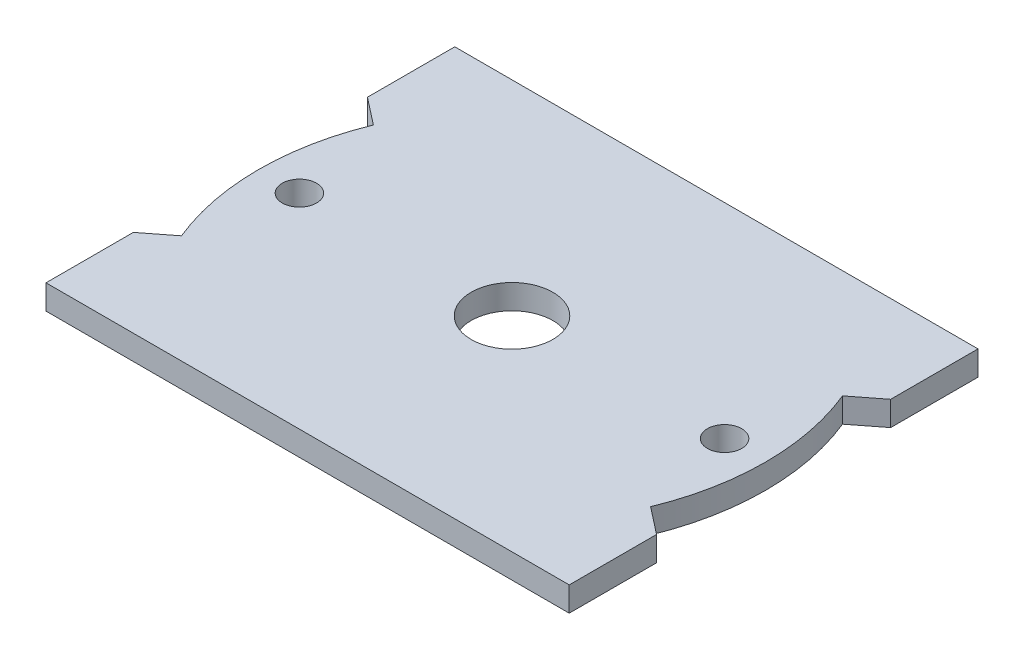
ISO-10303-21;
HEADER;
FILE_DESCRIPTION(('STEP AP214'),'2;1');
FILE_NAME('part.step','',(''),(''),'','','');
FILE_SCHEMA(('AUTOMOTIVE_DESIGN { 1 0 10303 214 1 1 1 1 }'));
ENDSEC;
DATA;
#1=APPLICATION_CONTEXT('core data for automotive mechanical design processes');
#2=APPLICATION_PROTOCOL_DEFINITION('international standard','automotive_design',2000,#1);
#3=PRODUCT_CONTEXT('',#1,'mechanical');
#4=PRODUCT('Part','Part','',(#3));
#5=PRODUCT_RELATED_PRODUCT_CATEGORY('part','',(#4));
#6=PRODUCT_DEFINITION_FORMATION('','',#4);
#7=PRODUCT_DEFINITION_CONTEXT('part definition',#1,'design');
#8=PRODUCT_DEFINITION('design','',#6,#7);
#9=PRODUCT_DEFINITION_SHAPE('','',#8);
#10=(LENGTH_UNIT() NAMED_UNIT(*) SI_UNIT(.MILLI.,.METRE.));
#11=(NAMED_UNIT(*) PLANE_ANGLE_UNIT() SI_UNIT($,.RADIAN.));
#12=(NAMED_UNIT(*) SI_UNIT($,.STERADIAN.) SOLID_ANGLE_UNIT());
#13=UNCERTAINTY_MEASURE_WITH_UNIT(LENGTH_MEASURE(1.E-05),#10,'distance_accuracy_value','');
#14=(GEOMETRIC_REPRESENTATION_CONTEXT(3) GLOBAL_UNCERTAINTY_ASSIGNED_CONTEXT((#13)) GLOBAL_UNIT_ASSIGNED_CONTEXT((#10,
#11,#12)) REPRESENTATION_CONTEXT('',''));
#15=CARTESIAN_POINT('',(0.,0.,0.));
#16=DIRECTION('',(0.,0.,1.));
#17=DIRECTION('',(1.,0.,0.));
#18=AXIS2_PLACEMENT_3D('',#15,#16,#17);
#19=CARTESIAN_POINT('',(26.,3.,0.));
#20=DIRECTION('',(0.,-1.,0.));
#21=DIRECTION('',(0.,0.,-1.));
#22=AXIS2_PLACEMENT_3D('',#19,#20,#21);
#23=CYLINDRICAL_SURFACE('',#22,2.1);
#24=CARTESIAN_POINT('',(26.,3.,0.));
#25=DIRECTION('',(0.,1.,0.));
#26=DIRECTION('',(0.,0.,1.));
#27=AXIS2_PLACEMENT_3D('',#24,#25,#26);
#28=CIRCLE('',#27,2.1);
#29=CARTESIAN_POINT('',(26.,3.,2.09999999999999));
#30=VERTEX_POINT('',#29);
#31=EDGE_CURVE('E200',#30,#30,#28,.F.);
#32=ORIENTED_EDGE('',*,*,#31,.F.);
#33=EDGE_LOOP('',(#32));
#34=FACE_BOUND('',#33,.T.);
#35=CARTESIAN_POINT('',(26.,0.,0.));
#36=DIRECTION('',(0.,1.,0.));
#37=DIRECTION('',(0.,0.,1.));
#38=AXIS2_PLACEMENT_3D('',#35,#36,#37);
#39=CIRCLE('',#38,2.1);
#40=CARTESIAN_POINT('',(26.,0.,2.09999999999999));
#41=VERTEX_POINT('',#40);
#42=EDGE_CURVE('E235',#41,#41,#39,.F.);
#43=ORIENTED_EDGE('',*,*,#42,.T.);
#44=EDGE_LOOP('',(#43));
#45=FACE_BOUND('',#44,.T.);
#46=ADVANCED_FACE('F76',(#34,#45),#23,.F.);
#47=CARTESIAN_POINT('',(-26.,3.,0.));
#48=DIRECTION('',(0.,-1.,0.));
#49=DIRECTION('',(0.,0.,-1.));
#50=AXIS2_PLACEMENT_3D('',#47,#48,#49);
#51=CYLINDRICAL_SURFACE('',#50,2.1);
#52=CARTESIAN_POINT('',(-26.,3.,0.));
#53=DIRECTION('',(0.,1.,0.));
#54=DIRECTION('',(0.,0.,1.));
#55=AXIS2_PLACEMENT_3D('',#52,#53,#54);
#56=CIRCLE('',#55,2.1);
#57=CARTESIAN_POINT('',(-26.,3.,2.10000000000001));
#58=VERTEX_POINT('',#57);
#59=EDGE_CURVE('E194',#58,#58,#56,.T.);
#60=ORIENTED_EDGE('',*,*,#59,.T.);
#61=EDGE_LOOP('',(#60));
#62=FACE_BOUND('',#61,.T.);
#63=CARTESIAN_POINT('',(-26.,0.,0.));
#64=DIRECTION('',(0.,1.,0.));
#65=DIRECTION('',(0.,0.,1.));
#66=AXIS2_PLACEMENT_3D('',#63,#64,#65);
#67=CIRCLE('',#66,2.1);
#68=CARTESIAN_POINT('',(-26.,0.,2.10000000000001));
#69=VERTEX_POINT('',#68);
#70=EDGE_CURVE('E232',#69,#69,#67,.T.);
#71=ORIENTED_EDGE('',*,*,#70,.F.);
#72=EDGE_LOOP('',(#71));
#73=FACE_BOUND('',#72,.T.);
#74=ADVANCED_FACE('F308',(#62,#73),#51,.F.);
#75=CARTESIAN_POINT('',(32.,3.,0.));
#76=DIRECTION('',(-1.,0.,0.));
#77=DIRECTION('',(0.,0.,1.));
#78=AXIS2_PLACEMENT_3D('',#75,#76,#77);
#79=PLANE('',#78);
#80=DIRECTION('',(0.,0.,-1.));
#81=VECTOR('',#80,1.);
#82=CARTESIAN_POINT('',(32.,0.,0.));
#83=LINE('',#82,#81);
#84=CARTESIAN_POINT('',(32.,0.,25.));
#85=VERTEX_POINT('',#84);
#86=CARTESIAN_POINT('',(32.,0.,14.320549046737));
#87=VERTEX_POINT('',#86);
#88=EDGE_CURVE('E205',#85,#87,#83,.T.);
#89=ORIENTED_EDGE('',*,*,#88,.T.);
#90=DIRECTION('',(0.,-1.,0.));
#91=VECTOR('',#90,1.);
#92=CARTESIAN_POINT('',(32.,3.,14.320549046737));
#93=LINE('',#92,#91);
#94=CARTESIAN_POINT('',(32.,3.,14.320549046737));
#95=VERTEX_POINT('',#94);
#96=EDGE_CURVE('E86',#95,#87,#93,.T.);
#97=ORIENTED_EDGE('',*,*,#96,.F.);
#98=DIRECTION('',(0.,0.,-1.));
#99=VECTOR('',#98,1.);
#100=CARTESIAN_POINT('',(32.,3.,0.));
#101=LINE('',#100,#99);
#102=CARTESIAN_POINT('',(32.,3.,25.));
#103=VERTEX_POINT('',#102);
#104=EDGE_CURVE('E338',#103,#95,#101,.T.);
#105=ORIENTED_EDGE('',*,*,#104,.F.);
#106=DIRECTION('',(0.,-1.,0.));
#107=VECTOR('',#106,1.);
#108=CARTESIAN_POINT('',(32.,3.,25.));
#109=LINE('',#108,#107);
#110=EDGE_CURVE('E12',#103,#85,#109,.T.);
#111=ORIENTED_EDGE('',*,*,#110,.T.);
#112=EDGE_LOOP('',(#89,#97,#105,#111));
#113=FACE_BOUND('',#112,.T.);
#114=ADVANCED_FACE('F266',(#113),#79,.F.);
#115=CARTESIAN_POINT('',(5.18105564742899,3.,-6.63175122870911));
#116=DIRECTION('',(0.615644041972315,0.,-0.788024373724563));
#117=DIRECTION('',(-0.788024373724563,0.,-0.615644041972315));
#118=AXIS2_PLACEMENT_3D('',#115,#116,#117);
#119=PLANE('',#118);
#120=DIRECTION('',(0.788024373724563,0.,0.615644041972315));
#121=VECTOR('',#120,1.);
#122=CARTESIAN_POINT('',(5.18105564742899,0.,-6.63175122870911));
#123=LINE('',#122,#121);
#124=CARTESIAN_POINT('',(28.6924140746813,0.,11.7364975425818));
#125=VERTEX_POINT('',#124);
#126=EDGE_CURVE('E208',#125,#87,#123,.T.);
#127=ORIENTED_EDGE('',*,*,#126,.F.);
#128=DIRECTION('',(0.,-1.,0.));
#129=VECTOR('',#128,1.);
#130=CARTESIAN_POINT('',(28.6924140746813,3.,11.7364975425818));
#131=LINE('',#130,#129);
#132=CARTESIAN_POINT('',(28.6924140746813,3.,11.7364975425818));
#133=VERTEX_POINT('',#132);
#134=EDGE_CURVE('E255',#133,#125,#131,.T.);
#135=ORIENTED_EDGE('',*,*,#134,.F.);
#136=DIRECTION('',(0.788024373724563,0.,0.615644041972315));
#137=VECTOR('',#136,1.);
#138=CARTESIAN_POINT('',(5.18105564742899,3.,-6.63175122870911));
#139=LINE('',#138,#137);
#140=EDGE_CURVE('E263',#133,#95,#139,.T.);
#141=ORIENTED_EDGE('',*,*,#140,.T.);
#142=ORIENTED_EDGE('',*,*,#96,.T.);
#143=EDGE_LOOP('',(#127,#135,#141,#142));
#144=FACE_BOUND('',#143,.T.);
#145=ADVANCED_FACE('F261',(#144),#119,.T.);
#146=CARTESIAN_POINT('',(0.,3.,0.));
#147=DIRECTION('',(0.,-1.,0.));
#148=DIRECTION('',(0.,0.,-1.));
#149=AXIS2_PLACEMENT_3D('',#146,#147,#148);
#150=CYLINDRICAL_SURFACE('',#149,31.);
#151=CARTESIAN_POINT('',(0.,0.,0.));
#152=DIRECTION('',(0.,1.,0.));
#153=DIRECTION('',(0.,0.,1.));
#154=AXIS2_PLACEMENT_3D('',#151,#152,#153);
#155=CIRCLE('',#154,31.);
#156=CARTESIAN_POINT('',(28.6924140746813,0.,-11.7364975425818));
#157=VERTEX_POINT('',#156);
#158=EDGE_CURVE('E211',#125,#157,#155,.T.);
#159=ORIENTED_EDGE('',*,*,#158,.T.);
#160=DIRECTION('',(0.,-1.,0.));
#161=VECTOR('',#160,1.);
#162=CARTESIAN_POINT('',(28.6924140746813,3.,-11.7364975425818));
#163=LINE('',#162,#161);
#164=CARTESIAN_POINT('',(28.6924140746813,3.,-11.7364975425818));
#165=VERTEX_POINT('',#164);
#166=EDGE_CURVE('E252',#165,#157,#163,.T.);
#167=ORIENTED_EDGE('',*,*,#166,.F.);
#168=CARTESIAN_POINT('',(0.,3.,0.));
#169=DIRECTION('',(0.,1.,0.));
#170=DIRECTION('',(0.,0.,1.));
#171=AXIS2_PLACEMENT_3D('',#168,#169,#170);
#172=CIRCLE('',#171,31.);
#173=EDGE_CURVE('E284',#133,#165,#172,.T.);
#174=ORIENTED_EDGE('',*,*,#173,.F.);
#175=ORIENTED_EDGE('',*,*,#134,.T.);
#176=EDGE_LOOP('',(#159,#167,#174,#175));
#177=FACE_BOUND('',#176,.T.);
#178=ADVANCED_FACE('F275',(#177),#150,.T.);
#179=CARTESIAN_POINT('',(5.18105564742899,3.,6.6317512287091));
#180=DIRECTION('',(-0.615644041972315,0.,-0.788024373724563));
#181=DIRECTION('',(-0.788024373724563,0.,0.615644041972316));
#182=AXIS2_PLACEMENT_3D('',#179,#180,#181);
#183=PLANE('',#182);
#184=DIRECTION('',(0.788024373724563,0.,-0.615644041972316));
#185=VECTOR('',#184,1.);
#186=CARTESIAN_POINT('',(5.18105564742899,0.,6.6317512287091));
#187=LINE('',#186,#185);
#188=CARTESIAN_POINT('',(32.,0.,-14.320549046737));
#189=VERTEX_POINT('',#188);
#190=EDGE_CURVE('E213',#157,#189,#187,.T.);
#191=ORIENTED_EDGE('',*,*,#190,.T.);
#192=DIRECTION('',(0.,-1.,0.));
#193=VECTOR('',#192,1.);
#194=CARTESIAN_POINT('',(32.,3.,-14.320549046737));
#195=LINE('',#194,#193);
#196=CARTESIAN_POINT('',(32.,3.,-14.320549046737));
#197=VERTEX_POINT('',#196);
#198=EDGE_CURVE('E249',#197,#189,#195,.T.);
#199=ORIENTED_EDGE('',*,*,#198,.F.);
#200=DIRECTION('',(0.788024373724563,0.,-0.615644041972316));
#201=VECTOR('',#200,1.);
#202=CARTESIAN_POINT('',(5.18105564742899,3.,6.6317512287091));
#203=LINE('',#202,#201);
#204=EDGE_CURVE('E281',#165,#197,#203,.T.);
#205=ORIENTED_EDGE('',*,*,#204,.F.);
#206=ORIENTED_EDGE('',*,*,#166,.T.);
#207=EDGE_LOOP('',(#191,#199,#205,#206));
#208=FACE_BOUND('',#207,.T.);
#209=ADVANCED_FACE('F279',(#208),#183,.F.);
#210=CARTESIAN_POINT('',(32.,3.,0.));
#211=DIRECTION('',(-1.,0.,0.));
#212=DIRECTION('',(0.,0.,1.));
#213=AXIS2_PLACEMENT_3D('',#210,#211,#212);
#214=PLANE('',#213);
#215=DIRECTION('',(0.,0.,-1.));
#216=VECTOR('',#215,1.);
#217=CARTESIAN_POINT('',(32.,0.,0.));
#218=LINE('',#217,#216);
#219=CARTESIAN_POINT('',(32.,0.,-25.));
#220=VERTEX_POINT('',#219);
#221=EDGE_CURVE('E215',#189,#220,#218,.T.);
#222=ORIENTED_EDGE('',*,*,#221,.T.);
#223=DIRECTION('',(0.,-1.,0.));
#224=VECTOR('',#223,1.);
#225=CARTESIAN_POINT('',(32.,3.,-25.));
#226=LINE('',#225,#224);
#227=CARTESIAN_POINT('',(32.,3.,-25.));
#228=VERTEX_POINT('',#227);
#229=EDGE_CURVE('E246',#228,#220,#226,.T.);
#230=ORIENTED_EDGE('',*,*,#229,.F.);
#231=DIRECTION('',(0.,0.,-1.));
#232=VECTOR('',#231,1.);
#233=CARTESIAN_POINT('',(32.,3.,0.));
#234=LINE('',#233,#232);
#235=EDGE_CURVE('E283',#197,#228,#234,.T.);
#236=ORIENTED_EDGE('',*,*,#235,.F.);
#237=ORIENTED_EDGE('',*,*,#198,.T.);
#238=EDGE_LOOP('',(#222,#230,#236,#237));
#239=FACE_BOUND('',#238,.T.);
#240=ADVANCED_FACE('F398',(#239),#214,.F.);
#241=CARTESIAN_POINT('',(0.,3.,-25.));
#242=DIRECTION('',(0.,0.,1.));
#243=DIRECTION('',(1.,0.,0.));
#244=AXIS2_PLACEMENT_3D('',#241,#242,#243);
#245=PLANE('',#244);
#246=DIRECTION('',(-1.,0.,0.));
#247=VECTOR('',#246,1.);
#248=CARTESIAN_POINT('',(0.,0.,-25.));
#249=LINE('',#248,#247);
#250=CARTESIAN_POINT('',(-32.,0.,-25.));
#251=VERTEX_POINT('',#250);
#252=EDGE_CURVE('E217',#220,#251,#249,.T.);
#253=ORIENTED_EDGE('',*,*,#252,.T.);
#254=DIRECTION('',(0.,-1.,0.));
#255=VECTOR('',#254,1.);
#256=CARTESIAN_POINT('',(-32.,3.,-25.));
#257=LINE('',#256,#255);
#258=CARTESIAN_POINT('',(-32.,3.,-25.));
#259=VERTEX_POINT('',#258);
#260=EDGE_CURVE('E244',#259,#251,#257,.T.);
#261=ORIENTED_EDGE('',*,*,#260,.F.);
#262=DIRECTION('',(-1.,0.,0.));
#263=VECTOR('',#262,1.);
#264=CARTESIAN_POINT('',(0.,3.,-25.));
#265=LINE('',#264,#263);
#266=EDGE_CURVE('E286',#228,#259,#265,.T.);
#267=ORIENTED_EDGE('',*,*,#266,.F.);
#268=ORIENTED_EDGE('',*,*,#229,.T.);
#269=EDGE_LOOP('',(#253,#261,#267,#268));
#270=FACE_BOUND('',#269,.T.);
#271=ADVANCED_FACE('F388',(#270),#245,.F.);
#272=CARTESIAN_POINT('',(-32.,3.,0.));
#273=DIRECTION('',(-1.,0.,0.));
#274=DIRECTION('',(0.,0.,1.));
#275=AXIS2_PLACEMENT_3D('',#272,#273,#274);
#276=PLANE('',#275);
#277=DIRECTION('',(0.,0.,-1.));
#278=VECTOR('',#277,1.);
#279=CARTESIAN_POINT('',(-32.,0.,0.));
#280=LINE('',#279,#278);
#281=CARTESIAN_POINT('',(-32.,0.,-14.320549046737));
#282=VERTEX_POINT('',#281);
#283=EDGE_CURVE('E220',#282,#251,#280,.T.);
#284=ORIENTED_EDGE('',*,*,#283,.F.);
#285=DIRECTION('',(0.,-1.,0.));
#286=VECTOR('',#285,1.);
#287=CARTESIAN_POINT('',(-32.,3.,-14.320549046737));
#288=LINE('',#287,#286);
#289=CARTESIAN_POINT('',(-32.,3.,-14.320549046737));
#290=VERTEX_POINT('',#289);
#291=EDGE_CURVE('E242',#290,#282,#288,.T.);
#292=ORIENTED_EDGE('',*,*,#291,.F.);
#293=DIRECTION('',(0.,0.,-1.));
#294=VECTOR('',#293,1.);
#295=CARTESIAN_POINT('',(-32.,3.,0.));
#296=LINE('',#295,#294);
#297=EDGE_CURVE('E292',#290,#259,#296,.T.);
#298=ORIENTED_EDGE('',*,*,#297,.T.);
#299=ORIENTED_EDGE('',*,*,#260,.T.);
#300=EDGE_LOOP('',(#284,#292,#298,#299));
#301=FACE_BOUND('',#300,.T.);
#302=ADVANCED_FACE('F379',(#301),#276,.T.);
#303=CARTESIAN_POINT('',(-5.181055647429,3.,6.63175122870911));
#304=DIRECTION('',(-0.615644041972315,0.,0.788024373724563));
#305=DIRECTION('',(0.788024373724563,0.,0.615644041972316));
#306=AXIS2_PLACEMENT_3D('',#303,#304,#305);
#307=PLANE('',#306);
#308=DIRECTION('',(-0.788024373724563,0.,-0.615644041972316));
#309=VECTOR('',#308,1.);
#310=CARTESIAN_POINT('',(-5.181055647429,0.,6.63175122870911));
#311=LINE('',#310,#309);
#312=CARTESIAN_POINT('',(-28.6924140746813,0.,-11.7364975425818));
#313=VERTEX_POINT('',#312);
#314=EDGE_CURVE('E223',#313,#282,#311,.T.);
#315=ORIENTED_EDGE('',*,*,#314,.F.);
#316=DIRECTION('',(0.,-1.,0.));
#317=VECTOR('',#316,1.);
#318=CARTESIAN_POINT('',(-28.6924140746813,3.,-11.7364975425818));
#319=LINE('',#318,#317);
#320=CARTESIAN_POINT('',(-28.6924140746813,3.,-11.7364975425818));
#321=VERTEX_POINT('',#320);
#322=EDGE_CURVE('E189',#321,#313,#319,.T.);
#323=ORIENTED_EDGE('',*,*,#322,.F.);
#324=DIRECTION('',(-0.788024373724563,0.,-0.615644041972316));
#325=VECTOR('',#324,1.);
#326=CARTESIAN_POINT('',(-5.181055647429,3.,6.63175122870911));
#327=LINE('',#326,#325);
#328=EDGE_CURVE('E179',#321,#290,#327,.T.);
#329=ORIENTED_EDGE('',*,*,#328,.T.);
#330=ORIENTED_EDGE('',*,*,#291,.T.);
#331=EDGE_LOOP('',(#315,#323,#329,#330));
#332=FACE_BOUND('',#331,.T.);
#333=ADVANCED_FACE('F296',(#332),#307,.T.);
#334=CARTESIAN_POINT('',(0.,3.,0.));
#335=DIRECTION('',(0.,-1.,0.));
#336=DIRECTION('',(0.,0.,-1.));
#337=AXIS2_PLACEMENT_3D('',#334,#335,#336);
#338=CYLINDRICAL_SURFACE('',#337,31.);
#339=CARTESIAN_POINT('',(0.,0.,0.));
#340=DIRECTION('',(0.,1.,0.));
#341=DIRECTION('',(0.,0.,1.));
#342=AXIS2_PLACEMENT_3D('',#339,#340,#341);
#343=CIRCLE('',#342,31.);
#344=CARTESIAN_POINT('',(-28.6924140746813,0.,11.7364975425818));
#345=VERTEX_POINT('',#344);
#346=EDGE_CURVE('E186',#313,#345,#343,.T.);
#347=ORIENTED_EDGE('',*,*,#346,.T.);
#348=DIRECTION('',(0.,-1.,0.));
#349=VECTOR('',#348,1.);
#350=CARTESIAN_POINT('',(-28.6924140746813,3.,11.7364975425818));
#351=LINE('',#350,#349);
#352=CARTESIAN_POINT('',(-28.6924140746813,3.,11.7364975425818));
#353=VERTEX_POINT('',#352);
#354=EDGE_CURVE('E183',#353,#345,#351,.T.);
#355=ORIENTED_EDGE('',*,*,#354,.F.);
#356=CARTESIAN_POINT('',(0.,3.,0.));
#357=DIRECTION('',(0.,1.,0.));
#358=DIRECTION('',(0.,0.,1.));
#359=AXIS2_PLACEMENT_3D('',#356,#357,#358);
#360=CIRCLE('',#359,31.);
#361=EDGE_CURVE('E169',#321,#353,#360,.T.);
#362=ORIENTED_EDGE('',*,*,#361,.F.);
#363=ORIENTED_EDGE('',*,*,#322,.T.);
#364=EDGE_LOOP('',(#347,#355,#362,#363));
#365=FACE_BOUND('',#364,.T.);
#366=ADVANCED_FACE('F184',(#365),#338,.T.);
#367=CARTESIAN_POINT('',(-5.181055647429,3.,-6.63175122870911));
#368=DIRECTION('',(0.615644041972316,0.,0.788024373724563));
#369=DIRECTION('',(0.788024373724563,0.,-0.615644041972316));
#370=AXIS2_PLACEMENT_3D('',#367,#368,#369);
#371=PLANE('',#370);
#372=DIRECTION('',(-0.788024373724563,0.,0.615644041972316));
#373=VECTOR('',#372,1.);
#374=CARTESIAN_POINT('',(-5.181055647429,0.,-6.63175122870911));
#375=LINE('',#374,#373);
#376=CARTESIAN_POINT('',(-32.,0.,14.320549046737));
#377=VERTEX_POINT('',#376);
#378=EDGE_CURVE('E227',#345,#377,#375,.T.);
#379=ORIENTED_EDGE('',*,*,#378,.T.);
#380=DIRECTION('',(0.,-1.,0.));
#381=VECTOR('',#380,1.);
#382=CARTESIAN_POINT('',(-32.,3.,14.320549046737));
#383=LINE('',#382,#381);
#384=CARTESIAN_POINT('',(-32.,3.,14.320549046737));
#385=VERTEX_POINT('',#384);
#386=EDGE_CURVE('E132',#385,#377,#383,.T.);
#387=ORIENTED_EDGE('',*,*,#386,.F.);
#388=DIRECTION('',(-0.788024373724563,0.,0.615644041972316));
#389=VECTOR('',#388,1.);
#390=CARTESIAN_POINT('',(-5.181055647429,3.,-6.63175122870911));
#391=LINE('',#390,#389);
#392=EDGE_CURVE('E176',#353,#385,#391,.T.);
#393=ORIENTED_EDGE('',*,*,#392,.F.);
#394=ORIENTED_EDGE('',*,*,#354,.T.);
#395=EDGE_LOOP('',(#379,#387,#393,#394));
#396=FACE_BOUND('',#395,.T.);
#397=ADVANCED_FACE('F191',(#396),#371,.F.);
#398=CARTESIAN_POINT('',(-32.,3.,0.));
#399=DIRECTION('',(-1.,0.,0.));
#400=DIRECTION('',(0.,0.,1.));
#401=AXIS2_PLACEMENT_3D('',#398,#399,#400);
#402=PLANE('',#401);
#403=DIRECTION('',(0.,0.,-1.));
#404=VECTOR('',#403,1.);
#405=CARTESIAN_POINT('',(-32.,0.,0.));
#406=LINE('',#405,#404);
#407=CARTESIAN_POINT('',(-32.,0.,25.));
#408=VERTEX_POINT('',#407);
#409=EDGE_CURVE('E229',#408,#377,#406,.T.);
#410=ORIENTED_EDGE('',*,*,#409,.F.);
#411=DIRECTION('',(0.,-1.,0.));
#412=VECTOR('',#411,1.);
#413=CARTESIAN_POINT('',(-32.,3.,25.));
#414=LINE('',#413,#412);
#415=CARTESIAN_POINT('',(-32.,3.,25.));
#416=VERTEX_POINT('',#415);
#417=EDGE_CURVE('E94',#416,#408,#414,.T.);
#418=ORIENTED_EDGE('',*,*,#417,.F.);
#419=DIRECTION('',(0.,0.,-1.));
#420=VECTOR('',#419,1.);
#421=CARTESIAN_POINT('',(-32.,3.,0.));
#422=LINE('',#421,#420);
#423=EDGE_CURVE('E192',#416,#385,#422,.T.);
#424=ORIENTED_EDGE('',*,*,#423,.T.);
#425=ORIENTED_EDGE('',*,*,#386,.T.);
#426=EDGE_LOOP('',(#410,#418,#424,#425));
#427=FACE_BOUND('',#426,.T.);
#428=ADVANCED_FACE('F298',(#427),#402,.T.);
#429=CARTESIAN_POINT('',(0.,3.,25.));
#430=DIRECTION('',(0.,0.,1.));
#431=DIRECTION('',(1.,0.,0.));
#432=AXIS2_PLACEMENT_3D('',#429,#430,#431);
#433=PLANE('',#432);
#434=DIRECTION('',(-1.,0.,0.));
#435=VECTOR('',#434,1.);
#436=CARTESIAN_POINT('',(0.,0.,25.));
#437=LINE('',#436,#435);
#438=EDGE_CURVE('E203',#85,#408,#437,.T.);
#439=ORIENTED_EDGE('',*,*,#438,.F.);
#440=ORIENTED_EDGE('',*,*,#110,.F.);
#441=DIRECTION('',(-1.,0.,0.));
#442=VECTOR('',#441,1.);
#443=CARTESIAN_POINT('',(0.,3.,25.));
#444=LINE('',#443,#442);
#445=EDGE_CURVE('E238',#103,#416,#444,.T.);
#446=ORIENTED_EDGE('',*,*,#445,.T.);
#447=ORIENTED_EDGE('',*,*,#417,.T.);
#448=EDGE_LOOP('',(#439,#440,#446,#447));
#449=FACE_BOUND('',#448,.T.);
#450=ADVANCED_FACE('F78',(#449),#433,.T.);
#451=CARTESIAN_POINT('',(0.,0.,0.));
#452=DIRECTION('',(0.,1.,0.));
#453=DIRECTION('',(0.,0.,1.));
#454=AXIS2_PLACEMENT_3D('',#451,#452,#453);
#455=PLANE('',#454);
#456=CARTESIAN_POINT('',(0.,0.,0.));
#457=DIRECTION('',(0.,1.,0.));
#458=DIRECTION('',(0.,0.,1.));
#459=AXIS2_PLACEMENT_3D('',#456,#457,#458);
#460=CIRCLE('',#459,5.);
#461=CARTESIAN_POINT('',(0.,0.,5.));
#462=VERTEX_POINT('',#461);
#463=EDGE_CURVE('E334',#462,#462,#460,.T.);
#464=ORIENTED_EDGE('',*,*,#463,.T.);
#465=EDGE_LOOP('',(#464));
#466=FACE_BOUND('',#465,.T.);
#467=ORIENTED_EDGE('',*,*,#438,.T.);
#468=ORIENTED_EDGE('',*,*,#409,.T.);
#469=ORIENTED_EDGE('',*,*,#378,.F.);
#470=ORIENTED_EDGE('',*,*,#346,.F.);
#471=ORIENTED_EDGE('',*,*,#314,.T.);
#472=ORIENTED_EDGE('',*,*,#283,.T.);
#473=ORIENTED_EDGE('',*,*,#252,.F.);
#474=ORIENTED_EDGE('',*,*,#221,.F.);
#475=ORIENTED_EDGE('',*,*,#190,.F.);
#476=ORIENTED_EDGE('',*,*,#158,.F.);
#477=ORIENTED_EDGE('',*,*,#126,.T.);
#478=ORIENTED_EDGE('',*,*,#88,.F.);
#479=EDGE_LOOP('',(#467,#468,#469,#470,#471,#472,#473,#474,#475,#476,#477,#478));
#480=FACE_BOUND('',#479,.T.);
#481=ORIENTED_EDGE('',*,*,#70,.T.);
#482=EDGE_LOOP('',(#481));
#483=FACE_BOUND('',#482,.T.);
#484=ORIENTED_EDGE('',*,*,#42,.F.);
#485=EDGE_LOOP('',(#484));
#486=FACE_BOUND('',#485,.T.);
#487=ADVANCED_FACE('F269',(#466,#480,#483,#486),#455,.F.);
#488=CARTESIAN_POINT('',(0.,3.,0.));
#489=DIRECTION('',(0.,1.,0.));
#490=DIRECTION('',(0.,0.,1.));
#491=AXIS2_PLACEMENT_3D('',#488,#489,#490);
#492=PLANE('',#491);
#493=CARTESIAN_POINT('',(0.,3.,0.));
#494=DIRECTION('',(0.,1.,0.));
#495=DIRECTION('',(0.,0.,1.));
#496=AXIS2_PLACEMENT_3D('',#493,#494,#495);
#497=CIRCLE('',#496,5.);
#498=CARTESIAN_POINT('',(0.,3.,5.));
#499=VERTEX_POINT('',#498);
#500=EDGE_CURVE('E80',#499,#499,#497,.F.);
#501=ORIENTED_EDGE('',*,*,#500,.T.);
#502=EDGE_LOOP('',(#501));
#503=FACE_BOUND('',#502,.T.);
#504=ORIENTED_EDGE('',*,*,#445,.F.);
#505=ORIENTED_EDGE('',*,*,#104,.T.);
#506=ORIENTED_EDGE('',*,*,#140,.F.);
#507=ORIENTED_EDGE('',*,*,#173,.T.);
#508=ORIENTED_EDGE('',*,*,#204,.T.);
#509=ORIENTED_EDGE('',*,*,#235,.T.);
#510=ORIENTED_EDGE('',*,*,#266,.T.);
#511=ORIENTED_EDGE('',*,*,#297,.F.);
#512=ORIENTED_EDGE('',*,*,#328,.F.);
#513=ORIENTED_EDGE('',*,*,#361,.T.);
#514=ORIENTED_EDGE('',*,*,#392,.T.);
#515=ORIENTED_EDGE('',*,*,#423,.F.);
#516=EDGE_LOOP('',(#504,#505,#506,#507,#508,#509,#510,#511,#512,#513,#514,#515));
#517=FACE_BOUND('',#516,.T.);
#518=ORIENTED_EDGE('',*,*,#59,.F.);
#519=EDGE_LOOP('',(#518));
#520=FACE_BOUND('',#519,.T.);
#521=ORIENTED_EDGE('',*,*,#31,.T.);
#522=EDGE_LOOP('',(#521));
#523=FACE_BOUND('',#522,.T.);
#524=ADVANCED_FACE('F172',(#503,#517,#520,#523),#492,.T.);
#525=CARTESIAN_POINT('',(0.,10.,0.));
#526=DIRECTION('',(0.,-1.,0.));
#527=DIRECTION('',(0.,0.,-1.));
#528=AXIS2_PLACEMENT_3D('',#525,#526,#527);
#529=CYLINDRICAL_SURFACE('',#528,5.);
#530=ORIENTED_EDGE('',*,*,#500,.F.);
#531=EDGE_LOOP('',(#530));
#532=FACE_BOUND('',#531,.T.);
#533=ORIENTED_EDGE('',*,*,#463,.F.);
#534=EDGE_LOOP('',(#533));
#535=FACE_BOUND('',#534,.T.);
#536=ADVANCED_FACE('F323',(#532,#535),#529,.F.);
#537=CLOSED_SHELL('',(#46,#74,#114,#145,#178,#209,#240,#271,#302,#333,#366,#397,#428,#450,#487,
#524,#536));
#538=MANIFOLD_SOLID_BREP('B2',#537);
#539=ADVANCED_BREP_SHAPE_REPRESENTATION('',(#18,#538),#14);
#540=SHAPE_DEFINITION_REPRESENTATION(#9,#539);
ENDSEC;
END-ISO-10303-21;
